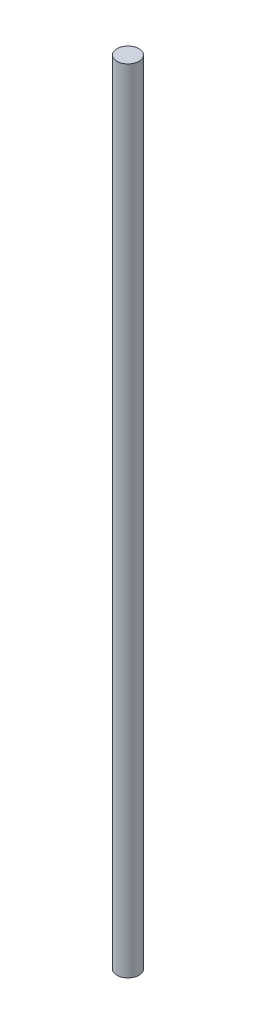
ISO-10303-21;
HEADER;
FILE_DESCRIPTION(('STEP AP214'),'2;1');
FILE_NAME('part.step','',(''),(''),'','','');
FILE_SCHEMA(('AUTOMOTIVE_DESIGN { 1 0 10303 214 1 1 1 1 }'));
ENDSEC;
DATA;
#1=APPLICATION_CONTEXT('core data for automotive mechanical design processes');
#2=APPLICATION_PROTOCOL_DEFINITION('international standard','automotive_design',2000,#1);
#3=PRODUCT_CONTEXT('',#1,'mechanical');
#4=PRODUCT('Part','Part','',(#3));
#5=PRODUCT_RELATED_PRODUCT_CATEGORY('part','',(#4));
#6=PRODUCT_DEFINITION_FORMATION('','',#4);
#7=PRODUCT_DEFINITION_CONTEXT('part definition',#1,'design');
#8=PRODUCT_DEFINITION('design','',#6,#7);
#9=PRODUCT_DEFINITION_SHAPE('','',#8);
#10=(LENGTH_UNIT() NAMED_UNIT(*) SI_UNIT(.MILLI.,.METRE.));
#11=(NAMED_UNIT(*) PLANE_ANGLE_UNIT() SI_UNIT($,.RADIAN.));
#12=(NAMED_UNIT(*) SI_UNIT($,.STERADIAN.) SOLID_ANGLE_UNIT());
#13=UNCERTAINTY_MEASURE_WITH_UNIT(LENGTH_MEASURE(1.E-05),#10,'distance_accuracy_value','');
#14=(GEOMETRIC_REPRESENTATION_CONTEXT(3) GLOBAL_UNCERTAINTY_ASSIGNED_CONTEXT((#13)) GLOBAL_UNIT_ASSIGNED_CONTEXT((#10,
#11,#12)) REPRESENTATION_CONTEXT('',''));
#15=CARTESIAN_POINT('',(0.,0.,0.));
#16=DIRECTION('',(0.,0.,1.));
#17=DIRECTION('',(1.,0.,0.));
#18=AXIS2_PLACEMENT_3D('',#15,#16,#17);
#19=CARTESIAN_POINT('',(0.,228.6,0.));
#20=DIRECTION('',(0.,-1.,0.));
#21=DIRECTION('',(0.,0.,-1.));
#22=AXIS2_PLACEMENT_3D('',#19,#20,#21);
#23=CYLINDRICAL_SURFACE('',#22,3.175);
#24=CARTESIAN_POINT('',(0.,228.6,0.));
#25=DIRECTION('',(0.,1.,0.));
#26=DIRECTION('',(0.,0.,1.));
#27=AXIS2_PLACEMENT_3D('',#24,#25,#26);
#28=CIRCLE('',#27,3.175);
#29=CARTESIAN_POINT('',(0.,228.6,3.175));
#30=VERTEX_POINT('',#29);
#31=EDGE_CURVE('E10',#30,#30,#28,.T.);
#32=ORIENTED_EDGE('',*,*,#31,.F.);
#33=EDGE_LOOP('',(#32));
#34=FACE_BOUND('',#33,.T.);
#35=CARTESIAN_POINT('',(0.,0.,0.));
#36=DIRECTION('',(0.,1.,0.));
#37=DIRECTION('',(0.,0.,1.));
#38=AXIS2_PLACEMENT_3D('',#35,#36,#37);
#39=CIRCLE('',#38,3.175);
#40=CARTESIAN_POINT('',(0.,0.,3.175));
#41=VERTEX_POINT('',#40);
#42=EDGE_CURVE('E46',#41,#41,#39,.T.);
#43=ORIENTED_EDGE('',*,*,#42,.T.);
#44=EDGE_LOOP('',(#43));
#45=FACE_BOUND('',#44,.T.);
#46=ADVANCED_FACE('F43',(#34,#45),#23,.T.);
#47=CARTESIAN_POINT('',(0.,228.6,0.));
#48=DIRECTION('',(0.,1.,0.));
#49=DIRECTION('',(0.,0.,1.));
#50=AXIS2_PLACEMENT_3D('',#47,#48,#49);
#51=PLANE('',#50);
#52=ORIENTED_EDGE('',*,*,#31,.T.);
#53=EDGE_LOOP('',(#52));
#54=FACE_BOUND('',#53,.T.);
#55=ADVANCED_FACE('F60',(#54),#51,.T.);
#56=CARTESIAN_POINT('',(0.,0.,0.));
#57=DIRECTION('',(0.,1.,0.));
#58=DIRECTION('',(0.,0.,1.));
#59=AXIS2_PLACEMENT_3D('',#56,#57,#58);
#60=PLANE('',#59);
#61=ORIENTED_EDGE('',*,*,#42,.F.);
#62=EDGE_LOOP('',(#61));
#63=FACE_BOUND('',#62,.T.);
#64=ADVANCED_FACE('F58',(#63),#60,.F.);
#65=CLOSED_SHELL('',(#46,#55,#64));
#66=MANIFOLD_SOLID_BREP('B2',#65);
#67=ADVANCED_BREP_SHAPE_REPRESENTATION('',(#18,#66),#14);
#68=SHAPE_DEFINITION_REPRESENTATION(#9,#67);
ENDSEC;
END-ISO-10303-21;
